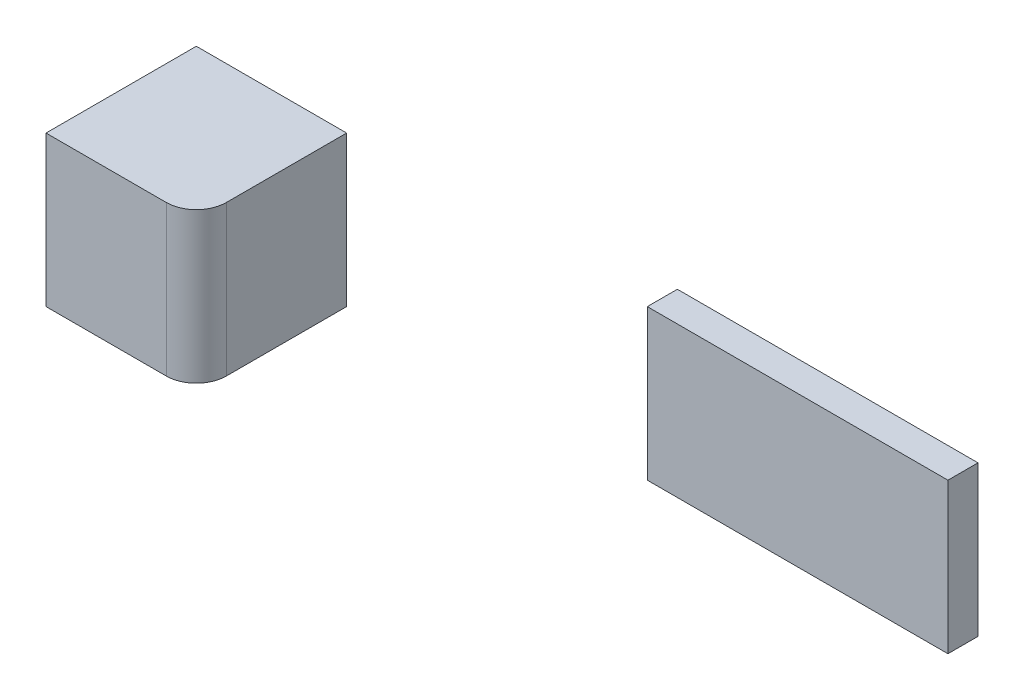
ISO-10303-21;
HEADER;
FILE_DESCRIPTION(('STEP AP214'),'2;1');
FILE_NAME('part.step','',(''),(''),'','','');
FILE_SCHEMA(('AUTOMOTIVE_DESIGN { 1 0 10303 214 1 1 1 1 }'));
ENDSEC;
DATA;
#1=APPLICATION_CONTEXT('core data for automotive mechanical design processes');
#2=APPLICATION_PROTOCOL_DEFINITION('international standard','automotive_design',2000,#1);
#3=PRODUCT_CONTEXT('',#1,'mechanical');
#4=PRODUCT('Part','Part','',(#3));
#5=PRODUCT_RELATED_PRODUCT_CATEGORY('part','',(#4));
#6=PRODUCT_DEFINITION_FORMATION('','',#4);
#7=PRODUCT_DEFINITION_CONTEXT('part definition',#1,'design');
#8=PRODUCT_DEFINITION('design','',#6,#7);
#9=PRODUCT_DEFINITION_SHAPE('','',#8);
#10=(LENGTH_UNIT() NAMED_UNIT(*) SI_UNIT(.MILLI.,.METRE.));
#11=(NAMED_UNIT(*) PLANE_ANGLE_UNIT() SI_UNIT($,.RADIAN.));
#12=(NAMED_UNIT(*) SI_UNIT($,.STERADIAN.) SOLID_ANGLE_UNIT());
#13=UNCERTAINTY_MEASURE_WITH_UNIT(LENGTH_MEASURE(1.E-05),#10,'distance_accuracy_value','');
#14=(GEOMETRIC_REPRESENTATION_CONTEXT(3) GLOBAL_UNCERTAINTY_ASSIGNED_CONTEXT((#13)) GLOBAL_UNIT_ASSIGNED_CONTEXT((#10,
#11,#12)) REPRESENTATION_CONTEXT('',''));
#15=CARTESIAN_POINT('',(0.,0.,0.));
#16=DIRECTION('',(0.,0.,1.));
#17=DIRECTION('',(1.,0.,0.));
#18=AXIS2_PLACEMENT_3D('',#15,#16,#17);
#19=CARTESIAN_POINT('',(30.,0.,-2.));
#20=DIRECTION('',(-1.,0.,0.));
#21=DIRECTION('',(0.,0.,1.));
#22=AXIS2_PLACEMENT_3D('',#19,#20,#21);
#23=PLANE('',#22);
#24=DIRECTION('',(0.,-1.,0.));
#25=VECTOR('',#24,1.);
#26=CARTESIAN_POINT('',(30.,0.,0.));
#27=LINE('',#26,#25);
#28=CARTESIAN_POINT('',(30.,10.,0.));
#29=VERTEX_POINT('',#28);
#30=CARTESIAN_POINT('',(30.,0.,0.));
#31=VERTEX_POINT('',#30);
#32=EDGE_CURVE('E120',#29,#31,#27,.T.);
#33=ORIENTED_EDGE('',*,*,#32,.F.);
#34=DIRECTION('',(0.,0.,1.));
#35=VECTOR('',#34,1.);
#36=CARTESIAN_POINT('',(30.,10.,-2.));
#37=LINE('',#36,#35);
#38=CARTESIAN_POINT('',(30.,10.,-2.));
#39=VERTEX_POINT('',#38);
#40=EDGE_CURVE('E12',#39,#29,#37,.T.);
#41=ORIENTED_EDGE('',*,*,#40,.F.);
#42=DIRECTION('',(0.,-1.,0.));
#43=VECTOR('',#42,1.);
#44=CARTESIAN_POINT('',(30.,0.,-2.));
#45=LINE('',#44,#43);
#46=CARTESIAN_POINT('',(30.,0.,-2.));
#47=VERTEX_POINT('',#46);
#48=EDGE_CURVE('E112',#39,#47,#45,.T.);
#49=ORIENTED_EDGE('',*,*,#48,.T.);
#50=DIRECTION('',(0.,0.,1.));
#51=VECTOR('',#50,1.);
#52=CARTESIAN_POINT('',(30.,0.,-2.));
#53=LINE('',#52,#51);
#54=EDGE_CURVE('E57',#47,#31,#53,.T.);
#55=ORIENTED_EDGE('',*,*,#54,.T.);
#56=EDGE_LOOP('',(#33,#41,#49,#55));
#57=FACE_BOUND('',#56,.T.);
#58=ADVANCED_FACE('F52',(#57),#23,.T.);
#59=CARTESIAN_POINT('',(30.,10.,-2.));
#60=DIRECTION('',(0.,1.,0.));
#61=DIRECTION('',(0.,0.,1.));
#62=AXIS2_PLACEMENT_3D('',#59,#60,#61);
#63=PLANE('',#62);
#64=DIRECTION('',(-1.,0.,0.));
#65=VECTOR('',#64,1.);
#66=CARTESIAN_POINT('',(30.,10.,0.));
#67=LINE('',#66,#65);
#68=CARTESIAN_POINT('',(50.,10.,0.));
#69=VERTEX_POINT('',#68);
#70=EDGE_CURVE('E114',#69,#29,#67,.T.);
#71=ORIENTED_EDGE('',*,*,#70,.F.);
#72=DIRECTION('',(0.,0.,1.));
#73=VECTOR('',#72,1.);
#74=CARTESIAN_POINT('',(50.,10.,-2.));
#75=LINE('',#74,#73);
#76=CARTESIAN_POINT('',(50.,10.,-2.));
#77=VERTEX_POINT('',#76);
#78=EDGE_CURVE('E65',#77,#69,#75,.T.);
#79=ORIENTED_EDGE('',*,*,#78,.F.);
#80=DIRECTION('',(-1.,0.,0.));
#81=VECTOR('',#80,1.);
#82=CARTESIAN_POINT('',(30.,10.,-2.));
#83=LINE('',#82,#81);
#84=EDGE_CURVE('E107',#77,#39,#83,.T.);
#85=ORIENTED_EDGE('',*,*,#84,.T.);
#86=ORIENTED_EDGE('',*,*,#40,.T.);
#87=EDGE_LOOP('',(#71,#79,#85,#86));
#88=FACE_BOUND('',#87,.T.);
#89=ADVANCED_FACE('F130',(#88),#63,.T.);
#90=CARTESIAN_POINT('',(50.,0.,-2.));
#91=DIRECTION('',(1.,0.,0.));
#92=DIRECTION('',(0.,0.,-1.));
#93=AXIS2_PLACEMENT_3D('',#90,#91,#92);
#94=PLANE('',#93);
#95=DIRECTION('',(0.,1.,0.));
#96=VECTOR('',#95,1.);
#97=CARTESIAN_POINT('',(50.,0.,0.));
#98=LINE('',#97,#96);
#99=CARTESIAN_POINT('',(50.,0.,0.));
#100=VERTEX_POINT('',#99);
#101=EDGE_CURVE('E103',#100,#69,#98,.T.);
#102=ORIENTED_EDGE('',*,*,#101,.F.);
#103=DIRECTION('',(0.,0.,1.));
#104=VECTOR('',#103,1.);
#105=CARTESIAN_POINT('',(50.,0.,-2.));
#106=LINE('',#105,#104);
#107=CARTESIAN_POINT('',(50.,0.,-2.));
#108=VERTEX_POINT('',#107);
#109=EDGE_CURVE('E98',#108,#100,#106,.T.);
#110=ORIENTED_EDGE('',*,*,#109,.F.);
#111=DIRECTION('',(0.,1.,0.));
#112=VECTOR('',#111,1.);
#113=CARTESIAN_POINT('',(50.,0.,-2.));
#114=LINE('',#113,#112);
#115=EDGE_CURVE('E101',#108,#77,#114,.T.);
#116=ORIENTED_EDGE('',*,*,#115,.T.);
#117=ORIENTED_EDGE('',*,*,#78,.T.);
#118=EDGE_LOOP('',(#102,#110,#116,#117));
#119=FACE_BOUND('',#118,.T.);
#120=ADVANCED_FACE('F99',(#119),#94,.T.);
#121=CARTESIAN_POINT('',(30.,0.,-2.));
#122=DIRECTION('',(0.,-1.,0.));
#123=DIRECTION('',(0.,0.,-1.));
#124=AXIS2_PLACEMENT_3D('',#121,#122,#123);
#125=PLANE('',#124);
#126=DIRECTION('',(1.,0.,0.));
#127=VECTOR('',#126,1.);
#128=CARTESIAN_POINT('',(30.,0.,0.));
#129=LINE('',#128,#127);
#130=EDGE_CURVE('E117',#31,#100,#129,.T.);
#131=ORIENTED_EDGE('',*,*,#130,.F.);
#132=ORIENTED_EDGE('',*,*,#54,.F.);
#133=DIRECTION('',(1.,0.,0.));
#134=VECTOR('',#133,1.);
#135=CARTESIAN_POINT('',(30.,0.,-2.));
#136=LINE('',#135,#134);
#137=EDGE_CURVE('E110',#47,#108,#136,.T.);
#138=ORIENTED_EDGE('',*,*,#137,.T.);
#139=ORIENTED_EDGE('',*,*,#109,.T.);
#140=EDGE_LOOP('',(#131,#132,#138,#139));
#141=FACE_BOUND('',#140,.T.);
#142=ADVANCED_FACE('F109',(#141),#125,.T.);
#143=CARTESIAN_POINT('',(0.,0.,-2.));
#144=DIRECTION('',(0.,0.,-1.));
#145=DIRECTION('',(-1.,0.,0.));
#146=AXIS2_PLACEMENT_3D('',#143,#144,#145);
#147=PLANE('',#146);
#148=ORIENTED_EDGE('',*,*,#48,.F.);
#149=ORIENTED_EDGE('',*,*,#84,.F.);
#150=ORIENTED_EDGE('',*,*,#115,.F.);
#151=ORIENTED_EDGE('',*,*,#137,.F.);
#152=EDGE_LOOP('',(#148,#149,#150,#151));
#153=FACE_BOUND('',#152,.T.);
#154=ADVANCED_FACE('F106',(#153),#147,.T.);
#155=CARTESIAN_POINT('',(0.,0.,0.));
#156=DIRECTION('',(0.,0.,-1.));
#157=DIRECTION('',(-1.,0.,0.));
#158=AXIS2_PLACEMENT_3D('',#155,#156,#157);
#159=PLANE('',#158);
#160=ORIENTED_EDGE('',*,*,#32,.T.);
#161=ORIENTED_EDGE('',*,*,#130,.T.);
#162=ORIENTED_EDGE('',*,*,#101,.T.);
#163=ORIENTED_EDGE('',*,*,#70,.T.);
#164=EDGE_LOOP('',(#160,#161,#162,#163));
#165=FACE_BOUND('',#164,.T.);
#166=ADVANCED_FACE('F127',(#165),#159,.F.);
#167=CLOSED_SHELL('',(#58,#89,#120,#142,#154,#166));
#168=MANIFOLD_SOLID_BREP('B2',#167);
#169=CARTESIAN_POINT('',(0.,0.,10.));
#170=DIRECTION('',(1.,0.,0.));
#171=DIRECTION('',(0.,0.,-1.));
#172=AXIS2_PLACEMENT_3D('',#169,#170,#171);
#173=PLANE('',#172);
#174=DIRECTION('',(0.,-1.,0.));
#175=VECTOR('',#174,1.);
#176=CARTESIAN_POINT('',(0.,0.,0.));
#177=LINE('',#176,#175);
#178=CARTESIAN_POINT('',(0.,10.,0.));
#179=VERTEX_POINT('',#178);
#180=CARTESIAN_POINT('',(0.,0.,0.));
#181=VERTEX_POINT('',#180);
#182=EDGE_CURVE('E258',#179,#181,#177,.T.);
#183=ORIENTED_EDGE('',*,*,#182,.T.);
#184=DIRECTION('',(0.,0.,-1.));
#185=VECTOR('',#184,1.);
#186=CARTESIAN_POINT('',(0.,0.,10.));
#187=LINE('',#186,#185);
#188=CARTESIAN_POINT('',(0.,0.,10.));
#189=VERTEX_POINT('',#188);
#190=EDGE_CURVE('E239',#189,#181,#187,.T.);
#191=ORIENTED_EDGE('',*,*,#190,.F.);
#192=DIRECTION('',(0.,-1.,0.));
#193=VECTOR('',#192,1.);
#194=CARTESIAN_POINT('',(0.,0.,10.));
#195=LINE('',#194,#193);
#196=CARTESIAN_POINT('',(0.,10.,10.));
#197=VERTEX_POINT('',#196);
#198=EDGE_CURVE('E249',#197,#189,#195,.T.);
#199=ORIENTED_EDGE('',*,*,#198,.F.);
#200=DIRECTION('',(0.,0.,-1.));
#201=VECTOR('',#200,1.);
#202=CARTESIAN_POINT('',(0.,10.,10.));
#203=LINE('',#202,#201);
#204=EDGE_CURVE('E266',#197,#179,#203,.T.);
#205=ORIENTED_EDGE('',*,*,#204,.T.);
#206=EDGE_LOOP('',(#183,#191,#199,#205));
#207=FACE_BOUND('',#206,.T.);
#208=ADVANCED_FACE('F189',(#207),#173,.F.);
#209=CARTESIAN_POINT('',(0.,0.,10.));
#210=DIRECTION('',(0.,1.,0.));
#211=DIRECTION('',(0.,0.,1.));
#212=AXIS2_PLACEMENT_3D('',#209,#210,#211);
#213=PLANE('',#212);
#214=DIRECTION('',(0.,0.,-1.));
#215=VECTOR('',#214,1.);
#216=CARTESIAN_POINT('',(10.,0.,10.));
#217=LINE('',#216,#215);
#218=CARTESIAN_POINT('',(10.,0.,8.));
#219=VERTEX_POINT('',#218);
#220=CARTESIAN_POINT('',(10.,0.,0.));
#221=VERTEX_POINT('',#220);
#222=EDGE_CURVE('E256',#219,#221,#217,.T.);
#223=ORIENTED_EDGE('',*,*,#222,.F.);
#224=CARTESIAN_POINT('',(8.,0.,8.));
#225=DIRECTION('',(0.,1.,0.));
#226=DIRECTION('',(0.,0.,1.));
#227=AXIS2_PLACEMENT_3D('',#224,#225,#226);
#228=CIRCLE('',#227,2.);
#229=CARTESIAN_POINT('',(8.,0.,10.));
#230=VERTEX_POINT('',#229);
#231=EDGE_CURVE('E51',#219,#230,#228,.F.);
#232=ORIENTED_EDGE('',*,*,#231,.T.);
#233=DIRECTION('',(1.,0.,0.));
#234=VECTOR('',#233,1.);
#235=CARTESIAN_POINT('',(0.,0.,10.));
#236=LINE('',#235,#234);
#237=EDGE_CURVE('E233',#189,#230,#236,.T.);
#238=ORIENTED_EDGE('',*,*,#237,.F.);
#239=ORIENTED_EDGE('',*,*,#190,.T.);
#240=DIRECTION('',(1.,0.,0.));
#241=VECTOR('',#240,1.);
#242=CARTESIAN_POINT('',(0.,0.,0.));
#243=LINE('',#242,#241);
#244=EDGE_CURVE('E275',#181,#221,#243,.T.);
#245=ORIENTED_EDGE('',*,*,#244,.T.);
#246=EDGE_LOOP('',(#223,#232,#238,#239,#245));
#247=FACE_BOUND('',#246,.T.);
#248=ADVANCED_FACE('F237',(#247),#213,.F.);
#249=CARTESIAN_POINT('',(10.,0.,10.));
#250=DIRECTION('',(-1.,0.,0.));
#251=DIRECTION('',(0.,0.,1.));
#252=AXIS2_PLACEMENT_3D('',#249,#250,#251);
#253=PLANE('',#252);
#254=DIRECTION('',(0.,0.,-1.));
#255=VECTOR('',#254,1.);
#256=CARTESIAN_POINT('',(10.,10.,10.));
#257=LINE('',#256,#255);
#258=CARTESIAN_POINT('',(10.,10.,8.));
#259=VERTEX_POINT('',#258);
#260=CARTESIAN_POINT('',(10.,10.,0.));
#261=VERTEX_POINT('',#260);
#262=EDGE_CURVE('E261',#259,#261,#257,.T.);
#263=ORIENTED_EDGE('',*,*,#262,.F.);
#264=DIRECTION('',(0.,1.,0.));
#265=VECTOR('',#264,1.);
#266=CARTESIAN_POINT('',(10.,0.,8.));
#267=LINE('',#266,#265);
#268=EDGE_CURVE('E197',#259,#219,#267,.F.);
#269=ORIENTED_EDGE('',*,*,#268,.T.);
#270=ORIENTED_EDGE('',*,*,#222,.T.);
#271=DIRECTION('',(0.,1.,0.));
#272=VECTOR('',#271,1.);
#273=CARTESIAN_POINT('',(10.,0.,0.));
#274=LINE('',#273,#272);
#275=EDGE_CURVE('E267',#221,#261,#274,.T.);
#276=ORIENTED_EDGE('',*,*,#275,.T.);
#277=EDGE_LOOP('',(#263,#269,#270,#276));
#278=FACE_BOUND('',#277,.T.);
#279=ADVANCED_FACE('F276',(#278),#253,.F.);
#280=CARTESIAN_POINT('',(0.,10.,10.));
#281=DIRECTION('',(0.,-1.,0.));
#282=DIRECTION('',(0.,0.,-1.));
#283=AXIS2_PLACEMENT_3D('',#280,#281,#282);
#284=PLANE('',#283);
#285=DIRECTION('',(-1.,0.,0.));
#286=VECTOR('',#285,1.);
#287=CARTESIAN_POINT('',(0.,10.,10.));
#288=LINE('',#287,#286);
#289=CARTESIAN_POINT('',(8.,10.,10.));
#290=VERTEX_POINT('',#289);
#291=EDGE_CURVE('E242',#290,#197,#288,.T.);
#292=ORIENTED_EDGE('',*,*,#291,.F.);
#293=CARTESIAN_POINT('',(8.,10.,8.));
#294=DIRECTION('',(0.,-1.,0.));
#295=DIRECTION('',(0.,0.,-1.));
#296=AXIS2_PLACEMENT_3D('',#293,#294,#295);
#297=CIRCLE('',#296,2.);
#298=EDGE_CURVE('E211',#290,#259,#297,.F.);
#299=ORIENTED_EDGE('',*,*,#298,.T.);
#300=ORIENTED_EDGE('',*,*,#262,.T.);
#301=DIRECTION('',(-1.,0.,0.));
#302=VECTOR('',#301,1.);
#303=CARTESIAN_POINT('',(0.,10.,0.));
#304=LINE('',#303,#302);
#305=EDGE_CURVE('E251',#261,#179,#304,.T.);
#306=ORIENTED_EDGE('',*,*,#305,.T.);
#307=ORIENTED_EDGE('',*,*,#204,.F.);
#308=EDGE_LOOP('',(#292,#299,#300,#306,#307));
#309=FACE_BOUND('',#308,.T.);
#310=ADVANCED_FACE('F283',(#309),#284,.F.);
#311=CARTESIAN_POINT('',(0.,0.,10.));
#312=DIRECTION('',(0.,0.,-1.));
#313=DIRECTION('',(-1.,0.,0.));
#314=AXIS2_PLACEMENT_3D('',#311,#312,#313);
#315=PLANE('',#314);
#316=ORIENTED_EDGE('',*,*,#237,.T.);
#317=DIRECTION('',(0.,1.,0.));
#318=VECTOR('',#317,1.);
#319=CARTESIAN_POINT('',(8.,0.,10.));
#320=LINE('',#319,#318);
#321=EDGE_CURVE('E260',#230,#290,#320,.T.);
#322=ORIENTED_EDGE('',*,*,#321,.T.);
#323=ORIENTED_EDGE('',*,*,#291,.T.);
#324=ORIENTED_EDGE('',*,*,#198,.T.);
#325=EDGE_LOOP('',(#316,#322,#323,#324));
#326=FACE_BOUND('',#325,.T.);
#327=ADVANCED_FACE('F248',(#326),#315,.F.);
#328=CARTESIAN_POINT('',(0.,0.,0.));
#329=DIRECTION('',(0.,0.,-1.));
#330=DIRECTION('',(-1.,0.,0.));
#331=AXIS2_PLACEMENT_3D('',#328,#329,#330);
#332=PLANE('',#331);
#333=ORIENTED_EDGE('',*,*,#182,.F.);
#334=ORIENTED_EDGE('',*,*,#305,.F.);
#335=ORIENTED_EDGE('',*,*,#275,.F.);
#336=ORIENTED_EDGE('',*,*,#244,.F.);
#337=EDGE_LOOP('',(#333,#334,#335,#336));
#338=FACE_BOUND('',#337,.T.);
#339=ADVANCED_FACE('F279',(#338),#332,.T.);
#340=CARTESIAN_POINT('',(8.,0.,8.));
#341=DIRECTION('',(0.,1.,0.));
#342=DIRECTION('',(0.,0.,1.));
#343=AXIS2_PLACEMENT_3D('',#340,#341,#342);
#344=CYLINDRICAL_SURFACE('',#343,2.);
#345=ORIENTED_EDGE('',*,*,#231,.F.);
#346=ORIENTED_EDGE('',*,*,#268,.F.);
#347=ORIENTED_EDGE('',*,*,#298,.F.);
#348=ORIENTED_EDGE('',*,*,#321,.F.);
#349=EDGE_LOOP('',(#345,#346,#347,#348));
#350=FACE_BOUND('',#349,.T.);
#351=ADVANCED_FACE('F194',(#350),#344,.T.);
#352=CLOSED_SHELL('',(#208,#248,#279,#310,#327,#339,#351));
#353=MANIFOLD_SOLID_BREP('B6',#352);
#354=ADVANCED_BREP_SHAPE_REPRESENTATION('',(#18,#168,#353),#14);
#355=SHAPE_DEFINITION_REPRESENTATION(#9,#354);
ENDSEC;
END-ISO-10303-21;
